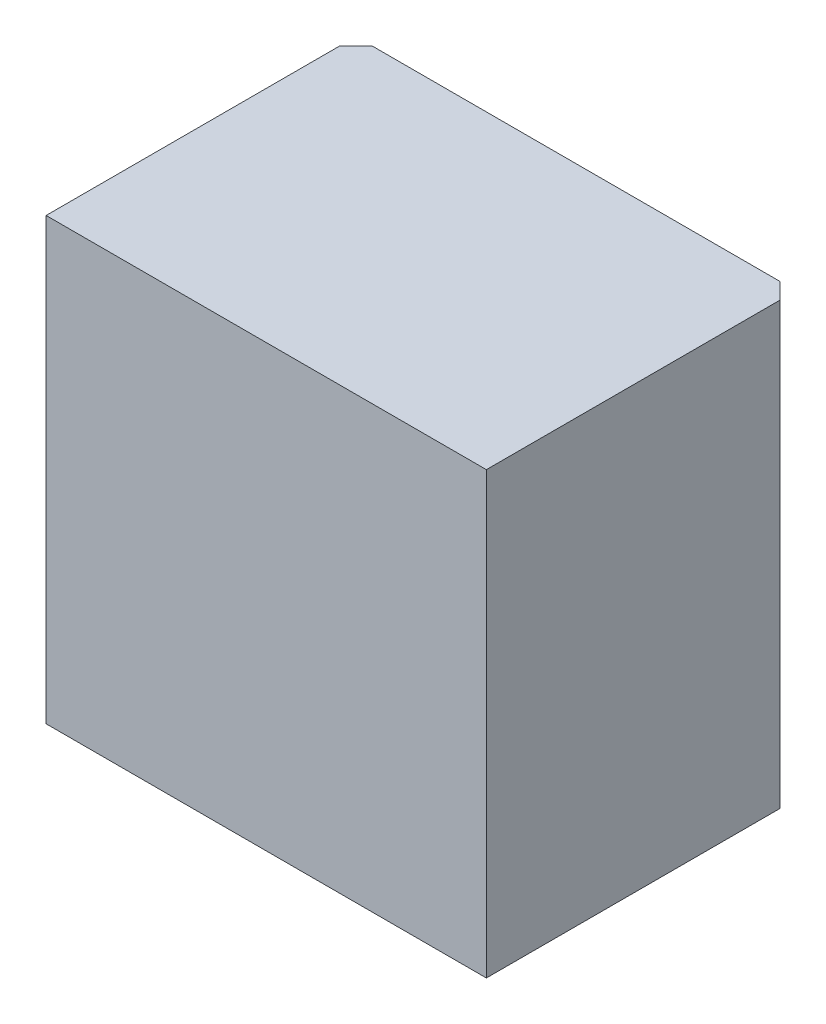
ISO-10303-21;
HEADER;
FILE_DESCRIPTION(('STEP AP214'),'2;1');
FILE_NAME('part.step','',(''),(''),'','','');
FILE_SCHEMA(('AUTOMOTIVE_DESIGN { 1 0 10303 214 1 1 1 1 }'));
ENDSEC;
DATA;
#1=APPLICATION_CONTEXT('core data for automotive mechanical design processes');
#2=APPLICATION_PROTOCOL_DEFINITION('international standard','automotive_design',2000,#1);
#3=PRODUCT_CONTEXT('',#1,'mechanical');
#4=PRODUCT('Part','Part','',(#3));
#5=PRODUCT_RELATED_PRODUCT_CATEGORY('part','',(#4));
#6=PRODUCT_DEFINITION_FORMATION('','',#4);
#7=PRODUCT_DEFINITION_CONTEXT('part definition',#1,'design');
#8=PRODUCT_DEFINITION('design','',#6,#7);
#9=PRODUCT_DEFINITION_SHAPE('','',#8);
#10=(LENGTH_UNIT() NAMED_UNIT(*) SI_UNIT(.MILLI.,.METRE.));
#11=(NAMED_UNIT(*) PLANE_ANGLE_UNIT() SI_UNIT($,.RADIAN.));
#12=(NAMED_UNIT(*) SI_UNIT($,.STERADIAN.) SOLID_ANGLE_UNIT());
#13=UNCERTAINTY_MEASURE_WITH_UNIT(LENGTH_MEASURE(1.E-05),#10,'distance_accuracy_value','');
#14=(GEOMETRIC_REPRESENTATION_CONTEXT(3) GLOBAL_UNCERTAINTY_ASSIGNED_CONTEXT((#13)) GLOBAL_UNIT_ASSIGNED_CONTEXT((#10,
#11,#12)) REPRESENTATION_CONTEXT('',''));
#15=CARTESIAN_POINT('',(0.,0.,0.));
#16=DIRECTION('',(0.,0.,1.));
#17=DIRECTION('',(1.,0.,0.));
#18=AXIS2_PLACEMENT_3D('',#15,#16,#17);
#19=CARTESIAN_POINT('',(63.15000122641,58.462500607751,0.025));
#20=DIRECTION('',(0.707106781186548,8.4321639643206E-09,-0.707106781186548));
#21=DIRECTION('',(-0.707106781186548,0.,-0.707106781186548));
#22=AXIS2_PLACEMENT_3D('',#19,#20,#21);
#23=PLANE('',#22);
#24=DIRECTION('',(-0.707106781186607,-8.4321815493605E-09,-0.707106781186488));
#25=VECTOR('',#24,1.);
#26=CARTESIAN_POINT('',(63.175001211951,59.6750006080489,0.0499999999999996));
#27=LINE('',#26,#25);
#28=CARTESIAN_POINT('',(63.1750012119509,59.675000607751,0.0499999999999811));
#29=VERTEX_POINT('',#28);
#30=CARTESIAN_POINT('',(63.12500122,59.6750006074529,4.0244780914951E-09));
#31=VERTEX_POINT('',#30);
#32=EDGE_CURVE('E68',#29,#31,#27,.T.);
#33=ORIENTED_EDGE('',*,*,#32,.F.);
#34=DIRECTION('',(-1.19248806385E-08,1.,0.));
#35=VECTOR('',#34,1.);
#36=CARTESIAN_POINT('',(63.175001232819,57.925000608049,0.05));
#37=LINE('',#36,#35);
#38=CARTESIAN_POINT('',(63.1750012240247,58.3250006080492,0.0499999959753352));
#39=VERTEX_POINT('',#38);
#40=EDGE_CURVE('E89',#39,#29,#37,.T.);
#41=ORIENTED_EDGE('',*,*,#40,.F.);
#42=DIRECTION('',(-0.707106781186548,0.,-0.707106781186548));
#43=VECTOR('',#42,1.);
#44=CARTESIAN_POINT('',(63.1500012272298,58.325000608049,0.0249999991801645));
#45=LINE('',#44,#43);
#46=CARTESIAN_POINT('',(63.1250012280492,58.3250006040246,-1.68465407286468E-13));
#47=VERTEX_POINT('',#46);
#48=EDGE_CURVE('E20',#39,#47,#45,.T.);
#49=ORIENTED_EDGE('',*,*,#48,.T.);
#50=DIRECTION('',(0.,1.,0.));
#51=VECTOR('',#50,1.);
#52=CARTESIAN_POINT('',(63.125001228049,59.0000006,0.));
#53=LINE('',#52,#51);
#54=EDGE_CURVE('E84',#47,#31,#53,.T.);
#55=ORIENTED_EDGE('',*,*,#54,.T.);
#56=EDGE_LOOP('',(#33,#41,#49,#55));
#57=FACE_BOUND('',#56,.T.);
#58=ADVANCED_FACE('F17',(#57),#23,.T.);
#59=CARTESIAN_POINT('',(62.50000122,59.0000006,0.));
#60=DIRECTION('',(0.,0.,1.));
#61=DIRECTION('',(1.,0.,0.));
#62=AXIS2_PLACEMENT_3D('',#59,#60,#61);
#63=PLANE('',#62);
#64=DIRECTION('',(-5.96244031924794E-09,1.,-5.96244031924794E-09));
#65=VECTOR('',#64,1.);
#66=CARTESIAN_POINT('',(61.8750012127705,59.537500592249,8.1950016163259E-10));
#67=LINE('',#66,#65);
#68=CARTESIAN_POINT('',(61.8750012119508,59.6750005959754,-1.67993394082056E-13));
#69=VERTEX_POINT('',#68);
#70=CARTESIAN_POINT('',(61.87500122,58.3250005925471,4.02447954754473E-09));
#71=VERTEX_POINT('',#70);
#72=EDGE_CURVE('E74',#69,#71,#67,.F.);
#73=ORIENTED_EDGE('',*,*,#72,.F.);
#74=DIRECTION('',(-1.,-1.19248806385E-08,0.));
#75=VECTOR('',#74,1.);
#76=CARTESIAN_POINT('',(63.204950611639,59.675000608406,0.));
#77=LINE('',#76,#75);
#78=EDGE_CURVE('E77',#31,#69,#77,.T.);
#79=ORIENTED_EDGE('',*,*,#78,.F.);
#80=ORIENTED_EDGE('',*,*,#54,.F.);
#81=DIRECTION('',(1.,1.19248806385E-08,0.));
#82=VECTOR('',#81,1.);
#83=CARTESIAN_POINT('',(61.795051828361,58.325000591594,0.));
#84=LINE('',#83,#82);
#85=EDGE_CURVE('E79',#71,#47,#84,.T.);
#86=ORIENTED_EDGE('',*,*,#85,.F.);
#87=EDGE_LOOP('',(#73,#79,#80,#86));
#88=FACE_BOUND('',#87,.T.);
#89=ADVANCED_FACE('F75',(#88),#63,.F.);
#90=CARTESIAN_POINT('',(61.85000121359,59.537500592249,0.025));
#91=DIRECTION('',(-0.707106781186548,-8.4321639643206E-09,-0.707106781186548));
#92=DIRECTION('',(-0.707106781186548,0.,0.707106781186548));
#93=AXIS2_PLACEMENT_3D('',#90,#91,#92);
#94=PLANE('',#93);
#95=DIRECTION('',(-0.707106781186607,-8.4321815493605E-09,0.707106781186488));
#96=VECTOR('',#95,1.);
#97=CARTESIAN_POINT('',(61.875001211951,59.6750005925465,0.));
#98=LINE('',#97,#96);
#99=CARTESIAN_POINT('',(61.8250012139632,59.6750005919506,0.0499999979876659));
#100=VERTEX_POINT('',#99);
#101=EDGE_CURVE('E83',#69,#100,#98,.T.);
#102=ORIENTED_EDGE('',*,*,#101,.F.);
#103=ORIENTED_EDGE('',*,*,#72,.T.);
#104=DIRECTION('',(0.707106781186557,8.43218154936109E-09,-0.707106781186538));
#105=VECTOR('',#104,1.);
#106=CARTESIAN_POINT('',(61.825001228049,58.3250005919511,0.0499999999999996));
#107=LINE('',#106,#105);
#108=CARTESIAN_POINT('',(61.8250012280491,58.3250005921001,0.0499999999999896));
#109=VERTEX_POINT('',#108);
#110=EDGE_CURVE('E102',#109,#71,#107,.T.);
#111=ORIENTED_EDGE('',*,*,#110,.F.);
#112=DIRECTION('',(1.19248806385E-08,-1.,0.));
#113=VECTOR('',#112,1.);
#114=CARTESIAN_POINT('',(61.825001207181,60.075000591951,0.05));
#115=LINE('',#114,#113);
#116=EDGE_CURVE('E93',#100,#109,#115,.T.);
#117=ORIENTED_EDGE('',*,*,#116,.F.);
#118=EDGE_LOOP('',(#102,#103,#111,#117));
#119=FACE_BOUND('',#118,.T.);
#120=ADVANCED_FACE('F92',(#119),#94,.T.);
#121=CARTESIAN_POINT('',(63.204950611639,59.675000608406,1.));
#122=DIRECTION('',(-1.19248806385E-08,1.,0.));
#123=DIRECTION('',(-1.,-1.19248806385E-08,0.));
#124=AXIS2_PLACEMENT_3D('',#121,#122,#123);
#125=PLANE('',#124);
#126=ORIENTED_EDGE('',*,*,#32,.T.);
#127=ORIENTED_EDGE('',*,*,#78,.T.);
#128=ORIENTED_EDGE('',*,*,#101,.T.);
#129=DIRECTION('',(0.,0.,1.));
#130=VECTOR('',#129,1.);
#131=CARTESIAN_POINT('',(61.825001211951,59.675000591951,0.));
#132=LINE('',#131,#130);
#133=CARTESIAN_POINT('',(61.8250012159755,59.6750005919506,0.95));
#134=VERTEX_POINT('',#133);
#135=EDGE_CURVE('E117',#134,#100,#132,.F.);
#136=ORIENTED_EDGE('',*,*,#135,.F.);
#137=DIRECTION('',(-1.,0.,0.));
#138=VECTOR('',#137,1.);
#139=CARTESIAN_POINT('',(62.50000122,59.675000591951,0.95));
#140=LINE('',#139,#138);
#141=CARTESIAN_POINT('',(63.1750012119509,59.6750006040244,0.95));
#142=VERTEX_POINT('',#141);
#143=EDGE_CURVE('E116',#134,#142,#140,.F.);
#144=ORIENTED_EDGE('',*,*,#143,.T.);
#145=DIRECTION('',(0.,0.,1.));
#146=VECTOR('',#145,1.);
#147=CARTESIAN_POINT('',(63.1750012119505,59.675000608049,0.));
#148=LINE('',#147,#146);
#149=EDGE_CURVE('E106',#29,#142,#148,.T.);
#150=ORIENTED_EDGE('',*,*,#149,.F.);
#151=EDGE_LOOP('',(#126,#127,#128,#136,#144,#150));
#152=FACE_BOUND('',#151,.T.);
#153=ADVANCED_FACE('F86',(#152),#125,.T.);
#154=CARTESIAN_POINT('',(63.175001232819,57.925000608049,0.));
#155=DIRECTION('',(1.,1.19248806385E-08,0.));
#156=DIRECTION('',(-1.19248806385E-08,1.,0.));
#157=AXIS2_PLACEMENT_3D('',#154,#155,#156);
#158=PLANE('',#157);
#159=ORIENTED_EDGE('',*,*,#149,.T.);
#160=DIRECTION('',(0.,1.,0.));
#161=VECTOR('',#160,1.);
#162=CARTESIAN_POINT('',(63.175001211951,59.0000006,0.95));
#163=LINE('',#162,#161);
#164=CARTESIAN_POINT('',(63.1750012240245,58.3250006080492,0.95));
#165=VERTEX_POINT('',#164);
#166=EDGE_CURVE('E119',#142,#165,#163,.F.);
#167=ORIENTED_EDGE('',*,*,#166,.T.);
#168=DIRECTION('',(0.,0.,1.));
#169=VECTOR('',#168,1.);
#170=CARTESIAN_POINT('',(63.175001228049,58.3250006080497,1.));
#171=LINE('',#170,#169);
#172=EDGE_CURVE('E103',#39,#165,#171,.T.);
#173=ORIENTED_EDGE('',*,*,#172,.F.);
#174=ORIENTED_EDGE('',*,*,#40,.T.);
#175=EDGE_LOOP('',(#159,#167,#173,#174));
#176=FACE_BOUND('',#175,.T.);
#177=ADVANCED_FACE('F112',(#176),#158,.T.);
#178=CARTESIAN_POINT('',(61.795051828361,58.325000591594,1.));
#179=DIRECTION('',(1.19248806385E-08,-1.,0.));
#180=DIRECTION('',(1.,1.19248806385E-08,0.));
#181=AXIS2_PLACEMENT_3D('',#178,#179,#180);
#182=PLANE('',#181);
#183=DIRECTION('',(-1.,0.,0.));
#184=VECTOR('',#183,1.);
#185=CARTESIAN_POINT('',(62.50000122,58.325000608049,0.95));
#186=LINE('',#185,#184);
#187=CARTESIAN_POINT('',(61.8250012280491,58.3250005959756,0.95));
#188=VERTEX_POINT('',#187);
#189=EDGE_CURVE('E26',#165,#188,#186,.T.);
#190=ORIENTED_EDGE('',*,*,#189,.T.);
#191=DIRECTION('',(0.,0.,1.));
#192=VECTOR('',#191,1.);
#193=CARTESIAN_POINT('',(61.8250012280496,58.325000591951,0.));
#194=LINE('',#193,#192);
#195=EDGE_CURVE('E34',#109,#188,#194,.T.);
#196=ORIENTED_EDGE('',*,*,#195,.F.);
#197=ORIENTED_EDGE('',*,*,#110,.T.);
#198=ORIENTED_EDGE('',*,*,#85,.T.);
#199=ORIENTED_EDGE('',*,*,#48,.F.);
#200=ORIENTED_EDGE('',*,*,#172,.T.);
#201=EDGE_LOOP('',(#190,#196,#197,#198,#199,#200));
#202=FACE_BOUND('',#201,.T.);
#203=ADVANCED_FACE('F101',(#202),#182,.T.);
#204=CARTESIAN_POINT('',(61.825001207181,60.075000591951,0.));
#205=DIRECTION('',(-1.,-1.19248806385E-08,0.));
#206=DIRECTION('',(1.19248806385E-08,-1.,0.));
#207=AXIS2_PLACEMENT_3D('',#204,#205,#206);
#208=PLANE('',#207);
#209=ORIENTED_EDGE('',*,*,#135,.T.);
#210=ORIENTED_EDGE('',*,*,#116,.T.);
#211=ORIENTED_EDGE('',*,*,#195,.T.);
#212=DIRECTION('',(0.,1.,0.));
#213=VECTOR('',#212,1.);
#214=CARTESIAN_POINT('',(61.825001228049,59.0000006,0.95));
#215=LINE('',#214,#213);
#216=EDGE_CURVE('E11',#188,#134,#215,.T.);
#217=ORIENTED_EDGE('',*,*,#216,.T.);
#218=EDGE_LOOP('',(#209,#210,#211,#217));
#219=FACE_BOUND('',#218,.T.);
#220=ADVANCED_FACE('F125',(#219),#208,.T.);
#221=CARTESIAN_POINT('',(62.50000122,59.0000006,0.95));
#222=DIRECTION('',(0.,0.,-1.));
#223=DIRECTION('',(-1.,0.,0.));
#224=AXIS2_PLACEMENT_3D('',#221,#222,#223);
#225=PLANE('',#224);
#226=ORIENTED_EDGE('',*,*,#189,.F.);
#227=ORIENTED_EDGE('',*,*,#166,.F.);
#228=ORIENTED_EDGE('',*,*,#143,.F.);
#229=ORIENTED_EDGE('',*,*,#216,.F.);
#230=EDGE_LOOP('',(#226,#227,#228,#229));
#231=FACE_BOUND('',#230,.T.);
#232=ADVANCED_FACE('F127',(#231),#225,.F.);
#233=CLOSED_SHELL('',(#58,#89,#120,#153,#177,#203,#220,#232));
#234=MANIFOLD_SOLID_BREP('B1',#233);
#235=ADVANCED_BREP_SHAPE_REPRESENTATION('',(#18,#234),#14);
#236=SHAPE_DEFINITION_REPRESENTATION(#9,#235);
ENDSEC;
END-ISO-10303-21;
